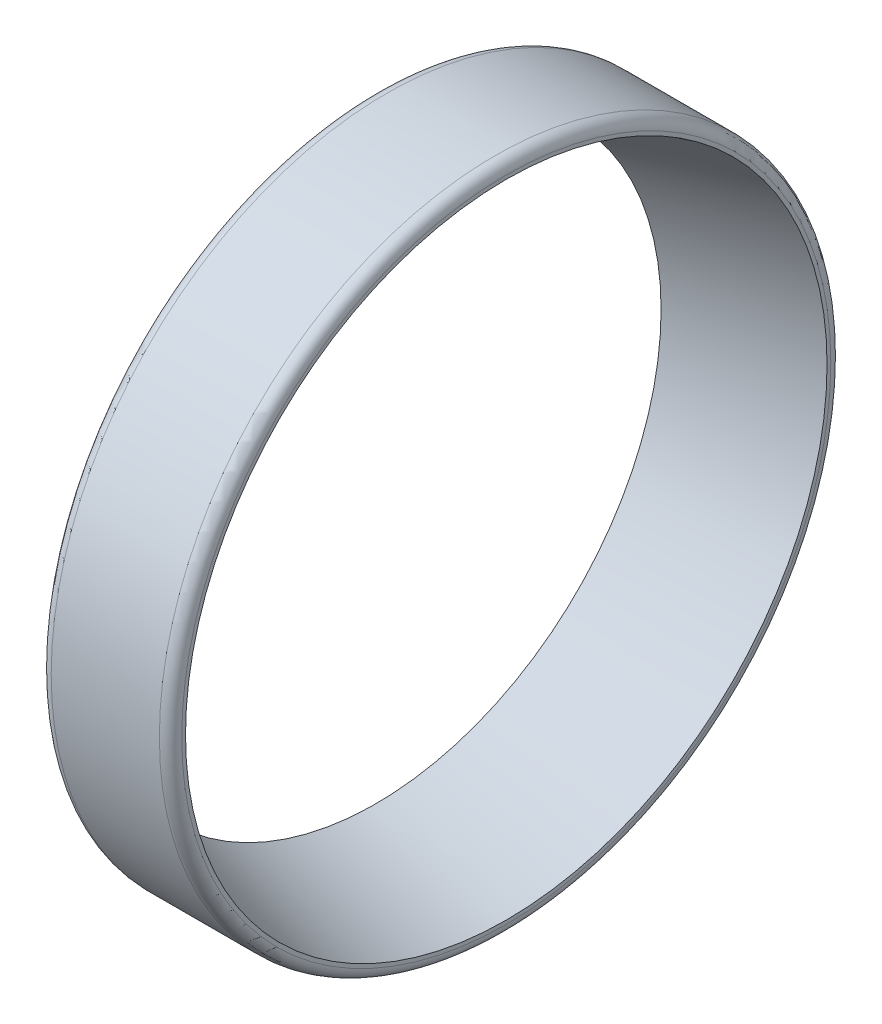
ISO-10303-21;
HEADER;
FILE_DESCRIPTION(('STEP AP214'),'2;1');
FILE_NAME('part.step','',(''),(''),'','','');
FILE_SCHEMA(('AUTOMOTIVE_DESIGN { 1 0 10303 214 1 1 1 1 }'));
ENDSEC;
DATA;
#1=APPLICATION_CONTEXT('core data for automotive mechanical design processes');
#2=APPLICATION_PROTOCOL_DEFINITION('international standard','automotive_design',2000,#1);
#3=PRODUCT_CONTEXT('',#1,'mechanical');
#4=PRODUCT('Part','Part','',(#3));
#5=PRODUCT_RELATED_PRODUCT_CATEGORY('part','',(#4));
#6=PRODUCT_DEFINITION_FORMATION('','',#4);
#7=PRODUCT_DEFINITION_CONTEXT('part definition',#1,'design');
#8=PRODUCT_DEFINITION('design','',#6,#7);
#9=PRODUCT_DEFINITION_SHAPE('','',#8);
#10=(LENGTH_UNIT() NAMED_UNIT(*) SI_UNIT(.MILLI.,.METRE.));
#11=(NAMED_UNIT(*) PLANE_ANGLE_UNIT() SI_UNIT($,.RADIAN.));
#12=(NAMED_UNIT(*) SI_UNIT($,.STERADIAN.) SOLID_ANGLE_UNIT());
#13=UNCERTAINTY_MEASURE_WITH_UNIT(LENGTH_MEASURE(1.E-05),#10,'distance_accuracy_value','');
#14=(GEOMETRIC_REPRESENTATION_CONTEXT(3) GLOBAL_UNCERTAINTY_ASSIGNED_CONTEXT((#13)) GLOBAL_UNIT_ASSIGNED_CONTEXT((#10,
#11,#12)) REPRESENTATION_CONTEXT('',''));
#15=CARTESIAN_POINT('',(0.,0.,0.));
#16=DIRECTION('',(0.,0.,1.));
#17=DIRECTION('',(1.,0.,0.));
#18=AXIS2_PLACEMENT_3D('',#15,#16,#17);
#19=CARTESIAN_POINT('',(-21.5000000000006,0.,0.));
#20=DIRECTION('',(1.,0.,0.));
#21=DIRECTION('',(0.,0.,-1.));
#22=AXIS2_PLACEMENT_3D('',#19,#20,#21);
#23=TOROIDAL_SURFACE('',#22,43.5000000000006,1.49999999999938);
#24=CARTESIAN_POINT('',(-23.,0.,0.));
#25=DIRECTION('',(1.,0.,0.));
#26=DIRECTION('',(0.,0.,-1.));
#27=AXIS2_PLACEMENT_3D('',#24,#25,#26);
#28=CIRCLE('',#27,43.5000000000006);
#29=CARTESIAN_POINT('',(-23.,0.,-43.5000000000006));
#30=VERTEX_POINT('',#29);
#31=EDGE_CURVE('E38',#30,#30,#28,.T.);
#32=ORIENTED_EDGE('',*,*,#31,.T.);
#33=EDGE_LOOP('',(#32));
#34=FACE_BOUND('',#33,.T.);
#35=CARTESIAN_POINT('',(-21.5,0.,0.));
#36=DIRECTION('',(1.,0.,0.));
#37=DIRECTION('',(0.,0.,-1.));
#38=AXIS2_PLACEMENT_3D('',#35,#36,#37);
#39=CIRCLE('',#38,45.);
#40=CARTESIAN_POINT('',(-21.5,0.,-45.));
#41=VERTEX_POINT('',#40);
#42=EDGE_CURVE('E35',#41,#41,#39,.T.);
#43=ORIENTED_EDGE('',*,*,#42,.F.);
#44=EDGE_LOOP('',(#43));
#45=FACE_BOUND('',#44,.T.);
#46=ADVANCED_FACE('F15',(#34,#45),#23,.T.);
#47=CARTESIAN_POINT('',(-23.,43.5,0.));
#48=DIRECTION('',(-1.,0.,0.));
#49=DIRECTION('',(0.,0.,1.));
#50=AXIS2_PLACEMENT_3D('',#47,#48,#49);
#51=PLANE('',#50);
#52=CARTESIAN_POINT('',(-23.,0.,0.));
#53=DIRECTION('',(1.,0.,0.));
#54=DIRECTION('',(0.,0.,-1.));
#55=AXIS2_PLACEMENT_3D('',#52,#53,#54);
#56=CIRCLE('',#55,38.2525);
#57=CARTESIAN_POINT('',(-23.,0.,-38.2525));
#58=VERTEX_POINT('',#57);
#59=EDGE_CURVE('E30',#58,#58,#56,.T.);
#60=ORIENTED_EDGE('',*,*,#59,.T.);
#61=EDGE_LOOP('',(#60));
#62=FACE_BOUND('',#61,.T.);
#63=ORIENTED_EDGE('',*,*,#31,.F.);
#64=EDGE_LOOP('',(#63));
#65=FACE_BOUND('',#64,.T.);
#66=ADVANCED_FACE('F44',(#62,#65),#51,.T.);
#67=CARTESIAN_POINT('',(-5.5,0.,0.));
#68=DIRECTION('',(1.,0.,0.));
#69=DIRECTION('',(0.,0.,-1.));
#70=AXIS2_PLACEMENT_3D('',#67,#68,#69);
#71=CYLINDRICAL_SURFACE('',#70,45.);
#72=ORIENTED_EDGE('',*,*,#42,.T.);
#73=EDGE_LOOP('',(#72));
#74=FACE_BOUND('',#73,.T.);
#75=CARTESIAN_POINT('',(-7.,0.,0.));
#76=DIRECTION('',(1.,0.,0.));
#77=DIRECTION('',(0.,0.,-1.));
#78=AXIS2_PLACEMENT_3D('',#75,#76,#77);
#79=CIRCLE('',#78,45.);
#80=CARTESIAN_POINT('',(-7.,0.,-45.));
#81=VERTEX_POINT('',#80);
#82=EDGE_CURVE('E26',#81,#81,#79,.T.);
#83=ORIENTED_EDGE('',*,*,#82,.F.);
#84=EDGE_LOOP('',(#83));
#85=FACE_BOUND('',#84,.T.);
#86=ADVANCED_FACE('F46',(#74,#85),#71,.T.);
#87=CARTESIAN_POINT('',(-23.,0.,0.));
#88=DIRECTION('',(1.,0.,0.));
#89=DIRECTION('',(0.,0.,-1.));
#90=AXIS2_PLACEMENT_3D('',#87,#88,#89);
#91=CONICAL_SURFACE('',#90,38.2525,0.264696885588637);
#92=CARTESIAN_POINT('',(-5.5,0.,0.));
#93=DIRECTION('',(1.,0.,0.));
#94=DIRECTION('',(0.,0.,-1.));
#95=AXIS2_PLACEMENT_3D('',#92,#93,#94);
#96=CIRCLE('',#95,42.996);
#97=CARTESIAN_POINT('',(-5.5,0.,-42.996));
#98=VERTEX_POINT('',#97);
#99=EDGE_CURVE('E22',#98,#98,#96,.T.);
#100=ORIENTED_EDGE('',*,*,#99,.T.);
#101=EDGE_LOOP('',(#100));
#102=FACE_BOUND('',#101,.T.);
#103=ORIENTED_EDGE('',*,*,#59,.F.);
#104=EDGE_LOOP('',(#103));
#105=FACE_BOUND('',#104,.T.);
#106=ADVANCED_FACE('F54',(#102,#105),#91,.F.);
#107=CARTESIAN_POINT('',(-6.99999999999973,0.,0.));
#108=DIRECTION('',(1.,0.,0.));
#109=DIRECTION('',(0.,0.,-1.));
#110=AXIS2_PLACEMENT_3D('',#107,#108,#109);
#111=TOROIDAL_SURFACE('',#110,43.5,1.49999999999973);
#112=ORIENTED_EDGE('',*,*,#82,.T.);
#113=EDGE_LOOP('',(#112));
#114=FACE_BOUND('',#113,.T.);
#115=CARTESIAN_POINT('',(-5.5,0.,0.));
#116=DIRECTION('',(1.,0.,0.));
#117=DIRECTION('',(0.,0.,-1.));
#118=AXIS2_PLACEMENT_3D('',#115,#116,#117);
#119=CIRCLE('',#118,43.5);
#120=CARTESIAN_POINT('',(-5.5,0.,-43.5));
#121=VERTEX_POINT('',#120);
#122=EDGE_CURVE('E10',#121,#121,#119,.T.);
#123=ORIENTED_EDGE('',*,*,#122,.F.);
#124=EDGE_LOOP('',(#123));
#125=FACE_BOUND('',#124,.T.);
#126=ADVANCED_FACE('F60',(#114,#125),#111,.T.);
#127=CARTESIAN_POINT('',(-5.5,42.996,0.));
#128=DIRECTION('',(1.,0.,0.));
#129=DIRECTION('',(0.,0.,-1.));
#130=AXIS2_PLACEMENT_3D('',#127,#128,#129);
#131=PLANE('',#130);
#132=ORIENTED_EDGE('',*,*,#122,.T.);
#133=EDGE_LOOP('',(#132));
#134=FACE_BOUND('',#133,.T.);
#135=ORIENTED_EDGE('',*,*,#99,.F.);
#136=EDGE_LOOP('',(#135));
#137=FACE_BOUND('',#136,.T.);
#138=ADVANCED_FACE('F17',(#134,#137),#131,.T.);
#139=CLOSED_SHELL('',(#46,#66,#86,#106,#126,#138));
#140=MANIFOLD_SOLID_BREP('B1',#139);
#141=ADVANCED_BREP_SHAPE_REPRESENTATION('',(#18,#140),#14);
#142=SHAPE_DEFINITION_REPRESENTATION(#9,#141);
ENDSEC;
END-ISO-10303-21;
